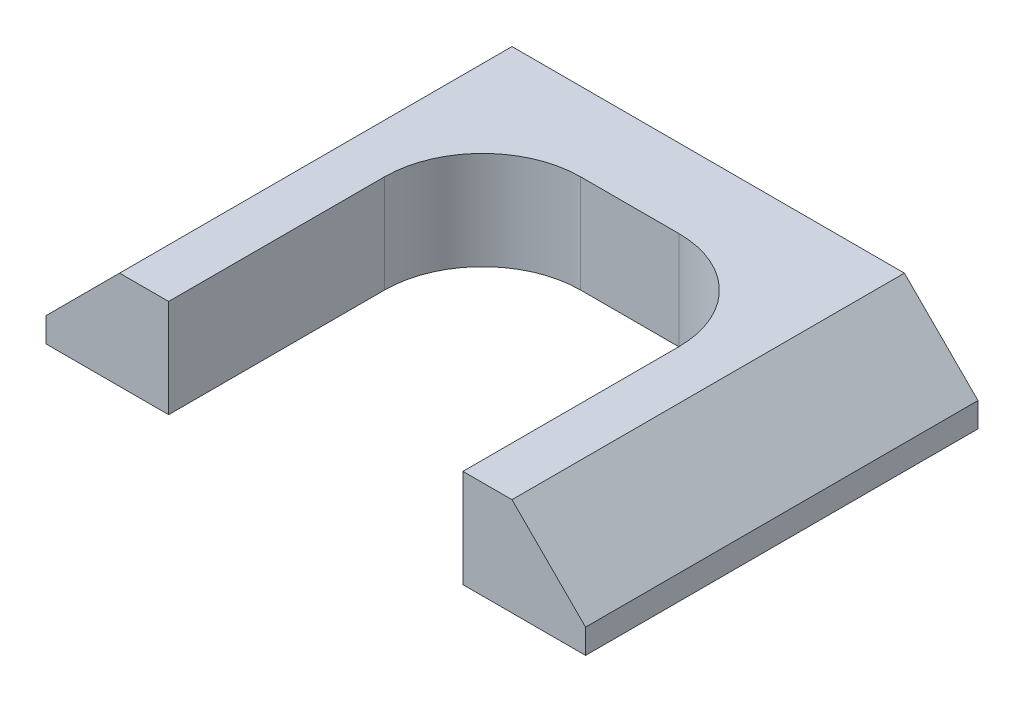
ISO-10303-21;
HEADER;
FILE_DESCRIPTION(('STEP AP214'),'2;1');
FILE_NAME('part.step','',(''),(''),'','','');
FILE_SCHEMA(('AUTOMOTIVE_DESIGN { 1 0 10303 214 1 1 1 1 }'));
ENDSEC;
DATA;
#1=APPLICATION_CONTEXT('core data for automotive mechanical design processes');
#2=APPLICATION_PROTOCOL_DEFINITION('international standard','automotive_design',2000,#1);
#3=PRODUCT_CONTEXT('',#1,'mechanical');
#4=PRODUCT('Part','Part','',(#3));
#5=PRODUCT_RELATED_PRODUCT_CATEGORY('part','',(#4));
#6=PRODUCT_DEFINITION_FORMATION('','',#4);
#7=PRODUCT_DEFINITION_CONTEXT('part definition',#1,'design');
#8=PRODUCT_DEFINITION('design','',#6,#7);
#9=PRODUCT_DEFINITION_SHAPE('','',#8);
#10=(LENGTH_UNIT() NAMED_UNIT(*) SI_UNIT(.MILLI.,.METRE.));
#11=(NAMED_UNIT(*) PLANE_ANGLE_UNIT() SI_UNIT($,.RADIAN.));
#12=(NAMED_UNIT(*) SI_UNIT($,.STERADIAN.) SOLID_ANGLE_UNIT());
#13=UNCERTAINTY_MEASURE_WITH_UNIT(LENGTH_MEASURE(1.E-05),#10,'distance_accuracy_value','');
#14=(GEOMETRIC_REPRESENTATION_CONTEXT(3) GLOBAL_UNCERTAINTY_ASSIGNED_CONTEXT((#13)) GLOBAL_UNIT_ASSIGNED_CONTEXT((#10,
#11,#12)) REPRESENTATION_CONTEXT('',''));
#15=CARTESIAN_POINT('',(0.,0.,0.));
#16=DIRECTION('',(0.,0.,1.));
#17=DIRECTION('',(1.,0.,0.));
#18=AXIS2_PLACEMENT_3D('',#15,#16,#17);
#19=CARTESIAN_POINT('',(0.,0.,50.8));
#20=DIRECTION('',(0.,0.,-1.));
#21=DIRECTION('',(-1.,0.,0.));
#22=AXIS2_PLACEMENT_3D('',#19,#20,#21);
#23=PLANE('',#22);
#24=DIRECTION('',(0.,1.,0.));
#25=VECTOR('',#24,1.);
#26=CARTESIAN_POINT('',(3.175,0.,50.8));
#27=LINE('',#26,#25);
#28=CARTESIAN_POINT('',(3.175,0.,50.8));
#29=VERTEX_POINT('',#28);
#30=CARTESIAN_POINT('',(3.175,3.17499999999997,50.8));
#31=VERTEX_POINT('',#30);
#32=EDGE_CURVE('E159',#29,#31,#27,.T.);
#33=ORIENTED_EDGE('',*,*,#32,.F.);
#34=DIRECTION('',(1.,0.,0.));
#35=VECTOR('',#34,1.);
#36=CARTESIAN_POINT('',(0.,0.,50.8));
#37=LINE('',#36,#35);
#38=CARTESIAN_POINT('',(19.0500000000001,0.,50.8));
#39=VERTEX_POINT('',#38);
#40=EDGE_CURVE('E179',#29,#39,#37,.T.);
#41=ORIENTED_EDGE('',*,*,#40,.T.);
#42=DIRECTION('',(0.,1.,0.));
#43=VECTOR('',#42,1.);
#44=CARTESIAN_POINT('',(19.0500000000001,0.,50.8));
#45=LINE('',#44,#43);
#46=CARTESIAN_POINT('',(19.0500000000001,12.7,50.8));
#47=VERTEX_POINT('',#46);
#48=EDGE_CURVE('E219',#39,#47,#45,.T.);
#49=ORIENTED_EDGE('',*,*,#48,.T.);
#50=DIRECTION('',(-1.,0.,0.));
#51=VECTOR('',#50,1.);
#52=CARTESIAN_POINT('',(63.4999999999999,12.7,50.8));
#53=LINE('',#52,#51);
#54=CARTESIAN_POINT('',(12.7000000000001,12.7,50.8));
#55=VERTEX_POINT('',#54);
#56=EDGE_CURVE('E193',#47,#55,#53,.T.);
#57=ORIENTED_EDGE('',*,*,#56,.T.);
#58=DIRECTION('',(-0.707106781186551,-0.707106781186544,0.));
#59=VECTOR('',#58,1.);
#60=CARTESIAN_POINT('',(12.7000000000001,12.7,50.8));
#61=LINE('',#60,#59);
#62=EDGE_CURVE('E180',#55,#31,#61,.T.);
#63=ORIENTED_EDGE('',*,*,#62,.T.);
#64=EDGE_LOOP('',(#33,#41,#49,#57,#63));
#65=FACE_BOUND('',#64,.T.);
#66=ADVANCED_FACE('F40',(#65),#23,.F.);
#67=CARTESIAN_POINT('',(12.7000000000001,12.7,50.8));
#68=DIRECTION('',(0.707106781186544,-0.707106781186551,0.));
#69=DIRECTION('',(0.707106781186551,0.707106781186544,0.));
#70=AXIS2_PLACEMENT_3D('',#67,#68,#69);
#71=PLANE('',#70);
#72=DIRECTION('',(0.,0.,-1.));
#73=VECTOR('',#72,1.);
#74=CARTESIAN_POINT('',(3.175,3.17499999999997,50.8));
#75=LINE('',#74,#73);
#76=CARTESIAN_POINT('',(3.175,3.17499999999996,0.));
#77=VERTEX_POINT('',#76);
#78=EDGE_CURVE('E68',#31,#77,#75,.T.);
#79=ORIENTED_EDGE('',*,*,#78,.F.);
#80=ORIENTED_EDGE('',*,*,#62,.F.);
#81=DIRECTION('',(0.,0.,-1.));
#82=VECTOR('',#81,1.);
#83=CARTESIAN_POINT('',(12.7000000000001,12.7,50.8));
#84=LINE('',#83,#82);
#85=CARTESIAN_POINT('',(12.7000000000001,12.7,0.));
#86=VERTEX_POINT('',#85);
#87=EDGE_CURVE('E197',#55,#86,#84,.T.);
#88=ORIENTED_EDGE('',*,*,#87,.T.);
#89=DIRECTION('',(-0.707106781186551,-0.707106781186544,0.));
#90=VECTOR('',#89,1.);
#91=CARTESIAN_POINT('',(12.7000000000001,12.7,0.));
#92=LINE('',#91,#90);
#93=EDGE_CURVE('E198',#86,#77,#92,.T.);
#94=ORIENTED_EDGE('',*,*,#93,.T.);
#95=EDGE_LOOP('',(#79,#80,#88,#94));
#96=FACE_BOUND('',#95,.T.);
#97=ADVANCED_FACE('F298',(#96),#71,.F.);
#98=CARTESIAN_POINT('',(0.,0.,50.8));
#99=DIRECTION('',(0.,1.,0.));
#100=DIRECTION('',(0.,0.,1.));
#101=AXIS2_PLACEMENT_3D('',#98,#99,#100);
#102=PLANE('',#101);
#103=DIRECTION('',(0.,0.,-1.));
#104=VECTOR('',#103,1.);
#105=CARTESIAN_POINT('',(73.025,0.,50.8));
#106=LINE('',#105,#104);
#107=CARTESIAN_POINT('',(73.025,0.,50.8));
#108=VERTEX_POINT('',#107);
#109=CARTESIAN_POINT('',(73.025,0.,0.));
#110=VERTEX_POINT('',#109);
#111=EDGE_CURVE('E59',#108,#110,#106,.T.);
#112=ORIENTED_EDGE('',*,*,#111,.F.);
#113=CARTESIAN_POINT('',(57.1499999999999,0.,50.8));
#114=VERTEX_POINT('',#113);
#115=EDGE_CURVE('E167',#114,#108,#37,.T.);
#116=ORIENTED_EDGE('',*,*,#115,.F.);
#117=DIRECTION('',(0.,0.,-1.));
#118=VECTOR('',#117,1.);
#119=CARTESIAN_POINT('',(57.1499999999999,0.,50.8));
#120=LINE('',#119,#118);
#121=CARTESIAN_POINT('',(57.1499999999999,0.,22.86));
#122=VERTEX_POINT('',#121);
#123=EDGE_CURVE('E262',#114,#122,#120,.T.);
#124=ORIENTED_EDGE('',*,*,#123,.T.);
#125=CARTESIAN_POINT('',(44.4499999999999,0.,22.86));
#126=DIRECTION('',(0.,1.,0.));
#127=DIRECTION('',(0.,0.,1.));
#128=AXIS2_PLACEMENT_3D('',#125,#126,#127);
#129=CIRCLE('',#128,12.7);
#130=CARTESIAN_POINT('',(44.4499999999999,0.,10.16));
#131=VERTEX_POINT('',#130);
#132=EDGE_CURVE('E240',#122,#131,#129,.T.);
#133=ORIENTED_EDGE('',*,*,#132,.T.);
#134=DIRECTION('',(-1.,0.,0.));
#135=VECTOR('',#134,1.);
#136=CARTESIAN_POINT('',(0.,0.,10.16));
#137=LINE('',#136,#135);
#138=CARTESIAN_POINT('',(31.7500000000001,0.,10.16));
#139=VERTEX_POINT('',#138);
#140=EDGE_CURVE('E202',#131,#139,#137,.T.);
#141=ORIENTED_EDGE('',*,*,#140,.T.);
#142=CARTESIAN_POINT('',(31.7500000000001,0.,22.86));
#143=DIRECTION('',(0.,1.,0.));
#144=DIRECTION('',(0.,0.,1.));
#145=AXIS2_PLACEMENT_3D('',#142,#143,#144);
#146=CIRCLE('',#145,12.7);
#147=CARTESIAN_POINT('',(19.0500000000001,0.,22.86));
#148=VERTEX_POINT('',#147);
#149=EDGE_CURVE('E49',#139,#148,#146,.T.);
#150=ORIENTED_EDGE('',*,*,#149,.T.);
#151=DIRECTION('',(0.,0.,1.));
#152=VECTOR('',#151,1.);
#153=CARTESIAN_POINT('',(19.0500000000001,0.,50.8));
#154=LINE('',#153,#152);
#155=EDGE_CURVE('E252',#148,#39,#154,.T.);
#156=ORIENTED_EDGE('',*,*,#155,.T.);
#157=ORIENTED_EDGE('',*,*,#40,.F.);
#158=DIRECTION('',(0.,0.,-1.));
#159=VECTOR('',#158,1.);
#160=CARTESIAN_POINT('',(3.175,0.,50.8));
#161=LINE('',#160,#159);
#162=CARTESIAN_POINT('',(3.175,0.,0.));
#163=VERTEX_POINT('',#162);
#164=EDGE_CURVE('E172',#29,#163,#161,.T.);
#165=ORIENTED_EDGE('',*,*,#164,.T.);
#166=DIRECTION('',(1.,0.,0.));
#167=VECTOR('',#166,1.);
#168=CARTESIAN_POINT('',(0.,0.,0.));
#169=LINE('',#168,#167);
#170=EDGE_CURVE('E170',#163,#110,#169,.T.);
#171=ORIENTED_EDGE('',*,*,#170,.T.);
#172=EDGE_LOOP('',(#112,#116,#124,#133,#141,#150,#156,#157,#165,#171));
#173=FACE_BOUND('',#172,.T.);
#174=ADVANCED_FACE('F165',(#173),#102,.F.);
#175=CARTESIAN_POINT('',(76.2,0.,50.8));
#176=DIRECTION('',(-0.707106781186543,-0.707106781186551,0.));
#177=DIRECTION('',(0.707106781186551,-0.707106781186544,0.));
#178=AXIS2_PLACEMENT_3D('',#175,#176,#177);
#179=PLANE('',#178);
#180=DIRECTION('',(0.,0.,1.));
#181=VECTOR('',#180,1.);
#182=CARTESIAN_POINT('',(73.025,3.17499999999996,50.8));
#183=LINE('',#182,#181);
#184=CARTESIAN_POINT('',(73.025,3.17499999999996,0.));
#185=VERTEX_POINT('',#184);
#186=CARTESIAN_POINT('',(73.025,3.17499999999996,50.8));
#187=VERTEX_POINT('',#186);
#188=EDGE_CURVE('E154',#185,#187,#183,.T.);
#189=ORIENTED_EDGE('',*,*,#188,.F.);
#190=DIRECTION('',(-0.707106781186551,0.707106781186544,0.));
#191=VECTOR('',#190,1.);
#192=CARTESIAN_POINT('',(76.2,0.,0.));
#193=LINE('',#192,#191);
#194=CARTESIAN_POINT('',(63.4999999999999,12.7,0.));
#195=VERTEX_POINT('',#194);
#196=EDGE_CURVE('E205',#185,#195,#193,.T.);
#197=ORIENTED_EDGE('',*,*,#196,.T.);
#198=DIRECTION('',(0.,0.,-1.));
#199=VECTOR('',#198,1.);
#200=CARTESIAN_POINT('',(63.4999999999999,12.7,50.8));
#201=LINE('',#200,#199);
#202=CARTESIAN_POINT('',(63.4999999999999,12.7,50.8));
#203=VERTEX_POINT('',#202);
#204=EDGE_CURVE('E213',#203,#195,#201,.T.);
#205=ORIENTED_EDGE('',*,*,#204,.F.);
#206=DIRECTION('',(-0.707106781186551,0.707106781186544,0.));
#207=VECTOR('',#206,1.);
#208=CARTESIAN_POINT('',(76.2,0.,50.8));
#209=LINE('',#208,#207);
#210=EDGE_CURVE('E184',#187,#203,#209,.T.);
#211=ORIENTED_EDGE('',*,*,#210,.F.);
#212=EDGE_LOOP('',(#189,#197,#205,#211));
#213=FACE_BOUND('',#212,.T.);
#214=ADVANCED_FACE('F307',(#213),#179,.F.);
#215=DIRECTION('',(0.,-1.,0.));
#216=VECTOR('',#215,1.);
#217=CARTESIAN_POINT('',(73.025,0.,50.8));
#218=LINE('',#217,#216);
#219=EDGE_CURVE('E151',#187,#108,#218,.T.);
#220=ORIENTED_EDGE('',*,*,#219,.F.);
#221=ORIENTED_EDGE('',*,*,#210,.T.);
#222=CARTESIAN_POINT('',(57.1499999999999,12.7,50.8));
#223=VERTEX_POINT('',#222);
#224=EDGE_CURVE('E194',#203,#223,#53,.T.);
#225=ORIENTED_EDGE('',*,*,#224,.T.);
#226=DIRECTION('',(0.,-1.,0.));
#227=VECTOR('',#226,1.);
#228=CARTESIAN_POINT('',(57.1499999999999,0.,50.8));
#229=LINE('',#228,#227);
#230=EDGE_CURVE('E177',#223,#114,#229,.T.);
#231=ORIENTED_EDGE('',*,*,#230,.T.);
#232=ORIENTED_EDGE('',*,*,#115,.T.);
#233=EDGE_LOOP('',(#220,#221,#225,#231,#232));
#234=FACE_BOUND('',#233,.T.);
#235=ADVANCED_FACE('F175',(#234),#23,.F.);
#236=CARTESIAN_POINT('',(0.,0.,0.));
#237=DIRECTION('',(0.,0.,-1.));
#238=DIRECTION('',(-1.,0.,0.));
#239=AXIS2_PLACEMENT_3D('',#236,#237,#238);
#240=PLANE('',#239);
#241=ORIENTED_EDGE('',*,*,#196,.F.);
#242=DIRECTION('',(0.,-1.,0.));
#243=VECTOR('',#242,1.);
#244=CARTESIAN_POINT('',(73.025,0.,0.));
#245=LINE('',#244,#243);
#246=EDGE_CURVE('E12',#185,#110,#245,.T.);
#247=ORIENTED_EDGE('',*,*,#246,.T.);
#248=ORIENTED_EDGE('',*,*,#170,.F.);
#249=DIRECTION('',(0.,1.,0.));
#250=VECTOR('',#249,1.);
#251=CARTESIAN_POINT('',(3.175,0.,0.));
#252=LINE('',#251,#250);
#253=EDGE_CURVE('E160',#163,#77,#252,.T.);
#254=ORIENTED_EDGE('',*,*,#253,.T.);
#255=ORIENTED_EDGE('',*,*,#93,.F.);
#256=DIRECTION('',(-1.,0.,0.));
#257=VECTOR('',#256,1.);
#258=CARTESIAN_POINT('',(63.4999999999999,12.7,0.));
#259=LINE('',#258,#257);
#260=EDGE_CURVE('E187',#195,#86,#259,.T.);
#261=ORIENTED_EDGE('',*,*,#260,.F.);
#262=EDGE_LOOP('',(#241,#247,#248,#254,#255,#261));
#263=FACE_BOUND('',#262,.T.);
#264=ADVANCED_FACE('F305',(#263),#240,.T.);
#265=CARTESIAN_POINT('',(63.4999999999999,12.7,50.8));
#266=DIRECTION('',(0.,-1.,0.));
#267=DIRECTION('',(1.,0.,0.));
#268=AXIS2_PLACEMENT_3D('',#265,#266,#267);
#269=PLANE('',#268);
#270=ORIENTED_EDGE('',*,*,#56,.F.);
#271=DIRECTION('',(0.,0.,1.));
#272=VECTOR('',#271,1.);
#273=CARTESIAN_POINT('',(19.0500000000001,12.7,50.8));
#274=LINE('',#273,#272);
#275=CARTESIAN_POINT('',(19.0500000000001,12.7,22.86));
#276=VERTEX_POINT('',#275);
#277=EDGE_CURVE('E270',#276,#47,#274,.T.);
#278=ORIENTED_EDGE('',*,*,#277,.F.);
#279=CARTESIAN_POINT('',(31.7500000000001,12.7,22.86));
#280=DIRECTION('',(0.,-1.,0.));
#281=DIRECTION('',(1.,0.,0.));
#282=AXIS2_PLACEMENT_3D('',#279,#280,#281);
#283=CIRCLE('',#282,12.7);
#284=CARTESIAN_POINT('',(31.7500000000001,12.7,10.16));
#285=VERTEX_POINT('',#284);
#286=EDGE_CURVE('E243',#276,#285,#283,.T.);
#287=ORIENTED_EDGE('',*,*,#286,.T.);
#288=DIRECTION('',(-1.,0.,0.));
#289=VECTOR('',#288,1.);
#290=CARTESIAN_POINT('',(19.0500000000001,12.7,10.16));
#291=LINE('',#290,#289);
#292=CARTESIAN_POINT('',(44.4499999999999,12.7,10.16));
#293=VERTEX_POINT('',#292);
#294=EDGE_CURVE('E269',#293,#285,#291,.T.);
#295=ORIENTED_EDGE('',*,*,#294,.F.);
#296=CARTESIAN_POINT('',(44.4499999999999,12.7,22.86));
#297=DIRECTION('',(0.,-1.,0.));
#298=DIRECTION('',(1.,0.,0.));
#299=AXIS2_PLACEMENT_3D('',#296,#297,#298);
#300=CIRCLE('',#299,12.7);
#301=CARTESIAN_POINT('',(57.1499999999999,12.7,22.86));
#302=VERTEX_POINT('',#301);
#303=EDGE_CURVE('E237',#293,#302,#300,.T.);
#304=ORIENTED_EDGE('',*,*,#303,.T.);
#305=DIRECTION('',(0.,0.,-1.));
#306=VECTOR('',#305,1.);
#307=CARTESIAN_POINT('',(57.1499999999999,12.7,50.8));
#308=LINE('',#307,#306);
#309=EDGE_CURVE('E275',#223,#302,#308,.T.);
#310=ORIENTED_EDGE('',*,*,#309,.F.);
#311=ORIENTED_EDGE('',*,*,#224,.F.);
#312=ORIENTED_EDGE('',*,*,#204,.T.);
#313=ORIENTED_EDGE('',*,*,#260,.T.);
#314=ORIENTED_EDGE('',*,*,#87,.F.);
#315=EDGE_LOOP('',(#270,#278,#287,#295,#304,#310,#311,#312,#313,#314));
#316=FACE_BOUND('',#315,.T.);
#317=ADVANCED_FACE('F268',(#316),#269,.F.);
#318=CARTESIAN_POINT('',(19.0500000000001,-63.5,10.16));
#319=DIRECTION('',(0.,0.,-1.));
#320=DIRECTION('',(-1.,0.,0.));
#321=AXIS2_PLACEMENT_3D('',#318,#319,#320);
#322=PLANE('',#321);
#323=ORIENTED_EDGE('',*,*,#140,.F.);
#324=DIRECTION('',(0.,1.,0.));
#325=VECTOR('',#324,1.);
#326=CARTESIAN_POINT('',(44.4499999999999,12.7,10.16));
#327=LINE('',#326,#325);
#328=EDGE_CURVE('E226',#131,#293,#327,.T.);
#329=ORIENTED_EDGE('',*,*,#328,.T.);
#330=ORIENTED_EDGE('',*,*,#294,.T.);
#331=DIRECTION('',(0.,1.,0.));
#332=VECTOR('',#331,1.);
#333=CARTESIAN_POINT('',(31.7500000000001,0.,10.16));
#334=LINE('',#333,#332);
#335=EDGE_CURVE('E223',#285,#139,#334,.F.);
#336=ORIENTED_EDGE('',*,*,#335,.T.);
#337=EDGE_LOOP('',(#323,#329,#330,#336));
#338=FACE_BOUND('',#337,.T.);
#339=ADVANCED_FACE('F272',(#338),#322,.F.);
#340=CARTESIAN_POINT('',(19.0500000000001,-63.5,50.8));
#341=DIRECTION('',(-1.,0.,0.));
#342=DIRECTION('',(0.,-1.,0.));
#343=AXIS2_PLACEMENT_3D('',#340,#341,#342);
#344=PLANE('',#343);
#345=ORIENTED_EDGE('',*,*,#155,.F.);
#346=DIRECTION('',(0.,1.,0.));
#347=VECTOR('',#346,1.);
#348=CARTESIAN_POINT('',(19.0500000000001,12.7,22.86));
#349=LINE('',#348,#347);
#350=EDGE_CURVE('E233',#148,#276,#349,.T.);
#351=ORIENTED_EDGE('',*,*,#350,.T.);
#352=ORIENTED_EDGE('',*,*,#277,.T.);
#353=ORIENTED_EDGE('',*,*,#48,.F.);
#354=EDGE_LOOP('',(#345,#351,#352,#353));
#355=FACE_BOUND('',#354,.T.);
#356=ADVANCED_FACE('F259',(#355),#344,.F.);
#357=CARTESIAN_POINT('',(57.1499999999999,-63.5,50.8));
#358=DIRECTION('',(1.,0.,0.));
#359=DIRECTION('',(0.,0.,-1.));
#360=AXIS2_PLACEMENT_3D('',#357,#358,#359);
#361=PLANE('',#360);
#362=ORIENTED_EDGE('',*,*,#309,.T.);
#363=DIRECTION('',(0.,1.,0.));
#364=VECTOR('',#363,1.);
#365=CARTESIAN_POINT('',(57.1499999999999,0.,22.86));
#366=LINE('',#365,#364);
#367=EDGE_CURVE('E230',#302,#122,#366,.F.);
#368=ORIENTED_EDGE('',*,*,#367,.T.);
#369=ORIENTED_EDGE('',*,*,#123,.F.);
#370=ORIENTED_EDGE('',*,*,#230,.F.);
#371=EDGE_LOOP('',(#362,#368,#369,#370));
#372=FACE_BOUND('',#371,.T.);
#373=ADVANCED_FACE('F313',(#372),#361,.F.);
#374=CARTESIAN_POINT('',(44.4499999999999,-63.5,22.86));
#375=DIRECTION('',(0.,-1.,0.));
#376=DIRECTION('',(1.,0.,0.));
#377=AXIS2_PLACEMENT_3D('',#374,#375,#376);
#378=CYLINDRICAL_SURFACE('',#377,12.7);
#379=ORIENTED_EDGE('',*,*,#132,.F.);
#380=ORIENTED_EDGE('',*,*,#367,.F.);
#381=ORIENTED_EDGE('',*,*,#303,.F.);
#382=ORIENTED_EDGE('',*,*,#328,.F.);
#383=EDGE_LOOP('',(#379,#380,#381,#382));
#384=FACE_BOUND('',#383,.T.);
#385=ADVANCED_FACE('F316',(#384),#378,.F.);
#386=CARTESIAN_POINT('',(31.7500000000001,-63.5,22.86));
#387=DIRECTION('',(0.,-1.,0.));
#388=DIRECTION('',(1.,0.,0.));
#389=AXIS2_PLACEMENT_3D('',#386,#387,#388);
#390=CYLINDRICAL_SURFACE('',#389,12.7);
#391=ORIENTED_EDGE('',*,*,#149,.F.);
#392=ORIENTED_EDGE('',*,*,#335,.F.);
#393=ORIENTED_EDGE('',*,*,#286,.F.);
#394=ORIENTED_EDGE('',*,*,#350,.F.);
#395=EDGE_LOOP('',(#391,#392,#393,#394));
#396=FACE_BOUND('',#395,.T.);
#397=ADVANCED_FACE('F42',(#396),#390,.F.);
#398=CARTESIAN_POINT('',(3.175,0.,50.8));
#399=DIRECTION('',(-1.,0.,0.));
#400=DIRECTION('',(0.,0.,1.));
#401=AXIS2_PLACEMENT_3D('',#398,#399,#400);
#402=PLANE('',#401);
#403=ORIENTED_EDGE('',*,*,#78,.T.);
#404=ORIENTED_EDGE('',*,*,#253,.F.);
#405=ORIENTED_EDGE('',*,*,#164,.F.);
#406=ORIENTED_EDGE('',*,*,#32,.T.);
#407=EDGE_LOOP('',(#403,#404,#405,#406));
#408=FACE_BOUND('',#407,.T.);
#409=ADVANCED_FACE('F294',(#408),#402,.T.);
#410=CARTESIAN_POINT('',(73.025,0.,50.8));
#411=DIRECTION('',(1.,0.,0.));
#412=DIRECTION('',(0.,0.,-1.));
#413=AXIS2_PLACEMENT_3D('',#410,#411,#412);
#414=PLANE('',#413);
#415=ORIENTED_EDGE('',*,*,#188,.T.);
#416=ORIENTED_EDGE('',*,*,#219,.T.);
#417=ORIENTED_EDGE('',*,*,#111,.T.);
#418=ORIENTED_EDGE('',*,*,#246,.F.);
#419=EDGE_LOOP('',(#415,#416,#417,#418));
#420=FACE_BOUND('',#419,.T.);
#421=ADVANCED_FACE('F152',(#420),#414,.T.);
#422=CLOSED_SHELL('',(#66,#97,#174,#214,#235,#264,#317,#339,#356,#373,#385,#397,#409,#421));
#423=MANIFOLD_SOLID_BREP('B2',#422);
#424=ADVANCED_BREP_SHAPE_REPRESENTATION('',(#18,#423),#14);
#425=SHAPE_DEFINITION_REPRESENTATION(#9,#424);
ENDSEC;
END-ISO-10303-21;
